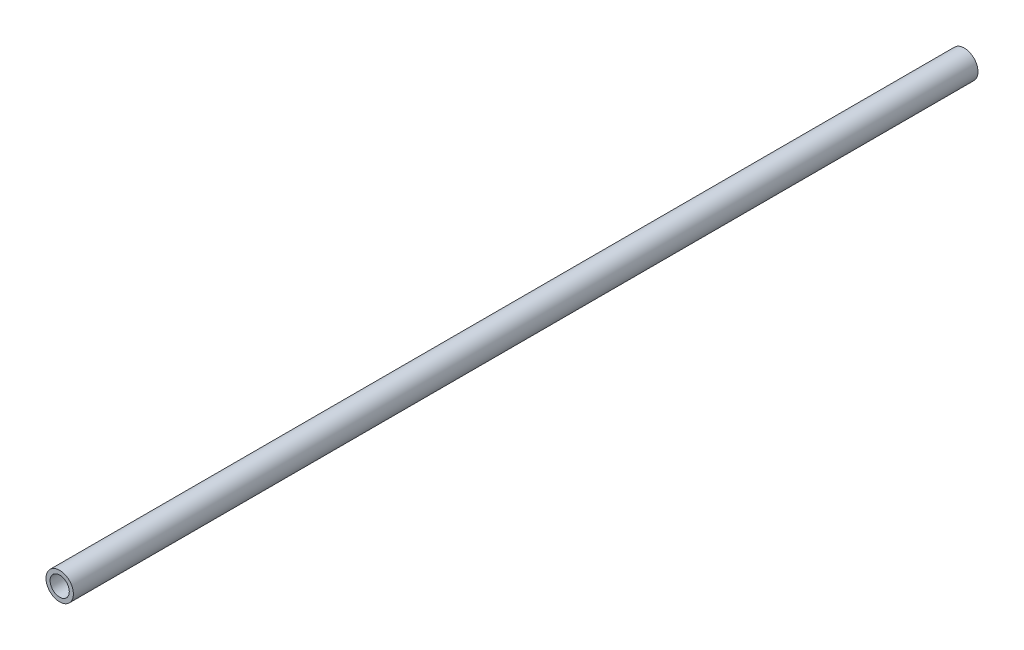
ISO-10303-21;
HEADER;
FILE_DESCRIPTION(('STEP AP214'),'2;1');
FILE_NAME('part.step','',(''),(''),'','','');
FILE_SCHEMA(('AUTOMOTIVE_DESIGN { 1 0 10303 214 1 1 1 1 }'));
ENDSEC;
DATA;
#1=APPLICATION_CONTEXT('core data for automotive mechanical design processes');
#2=APPLICATION_PROTOCOL_DEFINITION('international standard','automotive_design',2000,#1);
#3=PRODUCT_CONTEXT('',#1,'mechanical');
#4=PRODUCT('Part','Part','',(#3));
#5=PRODUCT_RELATED_PRODUCT_CATEGORY('part','',(#4));
#6=PRODUCT_DEFINITION_FORMATION('','',#4);
#7=PRODUCT_DEFINITION_CONTEXT('part definition',#1,'design');
#8=PRODUCT_DEFINITION('design','',#6,#7);
#9=PRODUCT_DEFINITION_SHAPE('','',#8);
#10=(LENGTH_UNIT() NAMED_UNIT(*) SI_UNIT(.MILLI.,.METRE.));
#11=(NAMED_UNIT(*) PLANE_ANGLE_UNIT() SI_UNIT($,.RADIAN.));
#12=(NAMED_UNIT(*) SI_UNIT($,.STERADIAN.) SOLID_ANGLE_UNIT());
#13=UNCERTAINTY_MEASURE_WITH_UNIT(LENGTH_MEASURE(1.E-05),#10,'distance_accuracy_value','');
#14=(GEOMETRIC_REPRESENTATION_CONTEXT(3) GLOBAL_UNCERTAINTY_ASSIGNED_CONTEXT((#13)) GLOBAL_UNIT_ASSIGNED_CONTEXT((#10,
#11,#12)) REPRESENTATION_CONTEXT('',''));
#15=CARTESIAN_POINT('',(0.,0.,0.));
#16=DIRECTION('',(0.,0.,1.));
#17=DIRECTION('',(1.,0.,0.));
#18=AXIS2_PLACEMENT_3D('',#15,#16,#17);
#19=CARTESIAN_POINT('',(0.,0.,165.));
#20=DIRECTION('',(0.,0.,1.));
#21=DIRECTION('',(1.,0.,0.));
#22=AXIS2_PLACEMENT_3D('',#19,#20,#21);
#23=PLANE('',#22);
#24=CARTESIAN_POINT('',(0.,0.,165.));
#25=DIRECTION('',(0.,0.,1.));
#26=DIRECTION('',(1.,0.,0.));
#27=AXIS2_PLACEMENT_3D('',#24,#25,#26);
#28=CIRCLE('',#27,5.);
#29=CARTESIAN_POINT('',(5.,0.,165.));
#30=VERTEX_POINT('',#29);
#31=EDGE_CURVE('E10',#30,#30,#28,.T.);
#32=ORIENTED_EDGE('',*,*,#31,.T.);
#33=EDGE_LOOP('',(#32));
#34=FACE_BOUND('',#33,.T.);
#35=CARTESIAN_POINT('',(0.,0.,165.));
#36=DIRECTION('',(0.,0.,1.));
#37=DIRECTION('',(1.,0.,0.));
#38=AXIS2_PLACEMENT_3D('',#35,#36,#37);
#39=CIRCLE('',#38,3.5);
#40=CARTESIAN_POINT('',(3.5,0.,165.));
#41=VERTEX_POINT('',#40);
#42=EDGE_CURVE('E44',#41,#41,#39,.T.);
#43=ORIENTED_EDGE('',*,*,#42,.F.);
#44=EDGE_LOOP('',(#43));
#45=FACE_BOUND('',#44,.T.);
#46=ADVANCED_FACE('F33',(#34,#45),#23,.T.);
#47=CARTESIAN_POINT('',(0.,0.,-165.));
#48=DIRECTION('',(0.,0.,1.));
#49=DIRECTION('',(1.,0.,0.));
#50=AXIS2_PLACEMENT_3D('',#47,#48,#49);
#51=PLANE('',#50);
#52=CARTESIAN_POINT('',(0.,0.,-165.));
#53=DIRECTION('',(0.,0.,1.));
#54=DIRECTION('',(1.,0.,0.));
#55=AXIS2_PLACEMENT_3D('',#52,#53,#54);
#56=CIRCLE('',#55,5.);
#57=CARTESIAN_POINT('',(5.,0.,-165.));
#58=VERTEX_POINT('',#57);
#59=EDGE_CURVE('E37',#58,#58,#56,.T.);
#60=ORIENTED_EDGE('',*,*,#59,.F.);
#61=EDGE_LOOP('',(#60));
#62=FACE_BOUND('',#61,.T.);
#63=CARTESIAN_POINT('',(0.,0.,-165.));
#64=DIRECTION('',(0.,0.,1.));
#65=DIRECTION('',(1.,0.,0.));
#66=AXIS2_PLACEMENT_3D('',#63,#64,#65);
#67=CIRCLE('',#66,3.5);
#68=CARTESIAN_POINT('',(3.5,0.,-165.));
#69=VERTEX_POINT('',#68);
#70=EDGE_CURVE('E46',#69,#69,#67,.T.);
#71=ORIENTED_EDGE('',*,*,#70,.T.);
#72=EDGE_LOOP('',(#71));
#73=FACE_BOUND('',#72,.T.);
#74=ADVANCED_FACE('F56',(#62,#73),#51,.F.);
#75=CARTESIAN_POINT('',(0.,0.,165.));
#76=DIRECTION('',(0.,0.,-1.));
#77=DIRECTION('',(-1.,0.,0.));
#78=AXIS2_PLACEMENT_3D('',#75,#76,#77);
#79=CYLINDRICAL_SURFACE('',#78,5.);
#80=ORIENTED_EDGE('',*,*,#31,.F.);
#81=EDGE_LOOP('',(#80));
#82=FACE_BOUND('',#81,.T.);
#83=ORIENTED_EDGE('',*,*,#59,.T.);
#84=EDGE_LOOP('',(#83));
#85=FACE_BOUND('',#84,.T.);
#86=ADVANCED_FACE('F35',(#82,#85),#79,.T.);
#87=CARTESIAN_POINT('',(0.,0.,165.));
#88=DIRECTION('',(0.,0.,-1.));
#89=DIRECTION('',(-1.,0.,0.));
#90=AXIS2_PLACEMENT_3D('',#87,#88,#89);
#91=CYLINDRICAL_SURFACE('',#90,3.5);
#92=ORIENTED_EDGE('',*,*,#42,.T.);
#93=EDGE_LOOP('',(#92));
#94=FACE_BOUND('',#93,.T.);
#95=ORIENTED_EDGE('',*,*,#70,.F.);
#96=EDGE_LOOP('',(#95));
#97=FACE_BOUND('',#96,.T.);
#98=ADVANCED_FACE('F52',(#94,#97),#91,.F.);
#99=CLOSED_SHELL('',(#46,#74,#86,#98));
#100=MANIFOLD_SOLID_BREP('B2',#99);
#101=ADVANCED_BREP_SHAPE_REPRESENTATION('',(#18,#100),#14);
#102=SHAPE_DEFINITION_REPRESENTATION(#9,#101);
ENDSEC;
END-ISO-10303-21;
